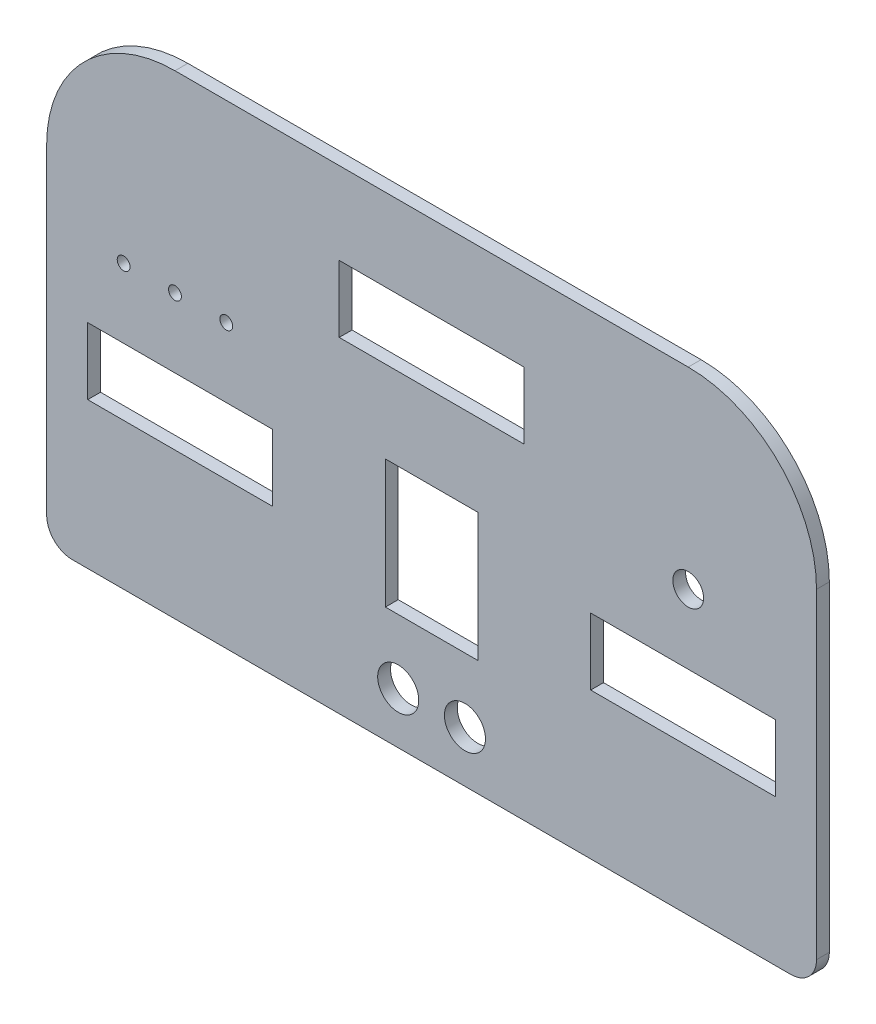
ISO-10303-21;
HEADER;
FILE_DESCRIPTION(('STEP AP214'),'2;1');
FILE_NAME('part.step','',(''),(''),'','','');
FILE_SCHEMA(('AUTOMOTIVE_DESIGN { 1 0 10303 214 1 1 1 1 }'));
ENDSEC;
DATA;
#1=APPLICATION_CONTEXT('core data for automotive mechanical design processes');
#2=APPLICATION_PROTOCOL_DEFINITION('international standard','automotive_design',2000,#1);
#3=PRODUCT_CONTEXT('',#1,'mechanical');
#4=PRODUCT('Part','Part','',(#3));
#5=PRODUCT_RELATED_PRODUCT_CATEGORY('part','',(#4));
#6=PRODUCT_DEFINITION_FORMATION('','',#4);
#7=PRODUCT_DEFINITION_CONTEXT('part definition',#1,'design');
#8=PRODUCT_DEFINITION('design','',#6,#7);
#9=PRODUCT_DEFINITION_SHAPE('','',#8);
#10=(LENGTH_UNIT() NAMED_UNIT(*) SI_UNIT(.MILLI.,.METRE.));
#11=(NAMED_UNIT(*) PLANE_ANGLE_UNIT() SI_UNIT($,.RADIAN.));
#12=(NAMED_UNIT(*) SI_UNIT($,.STERADIAN.) SOLID_ANGLE_UNIT());
#13=UNCERTAINTY_MEASURE_WITH_UNIT(LENGTH_MEASURE(1.E-05),#10,'distance_accuracy_value','');
#14=(GEOMETRIC_REPRESENTATION_CONTEXT(3) GLOBAL_UNCERTAINTY_ASSIGNED_CONTEXT((#13)) GLOBAL_UNIT_ASSIGNED_CONTEXT((#10,
#11,#12)) REPRESENTATION_CONTEXT('',''));
#15=CARTESIAN_POINT('',(0.,0.,0.));
#16=DIRECTION('',(0.,0.,1.));
#17=DIRECTION('',(1.,0.,0.));
#18=AXIS2_PLACEMENT_3D('',#15,#16,#17);
#19=CARTESIAN_POINT('',(140.,-82.5,5.));
#20=DIRECTION('',(0.,0.,-1.));
#21=DIRECTION('',(-1.,0.,0.));
#22=AXIS2_PLACEMENT_3D('',#19,#20,#21);
#23=PLANE('',#22);
#24=DIRECTION('',(0.,-1.,0.));
#25=VECTOR('',#24,1.);
#26=CARTESIAN_POINT('',(62.,-35.5,5.));
#27=LINE('',#26,#25);
#28=CARTESIAN_POINT('',(62.,-9.49999999999997,5.));
#29=VERTEX_POINT('',#28);
#30=CARTESIAN_POINT('',(62.,-35.5,5.));
#31=VERTEX_POINT('',#30);
#32=EDGE_CURVE('E239',#29,#31,#27,.T.);
#33=ORIENTED_EDGE('',*,*,#32,.F.);
#34=DIRECTION('',(-1.,0.,0.));
#35=VECTOR('',#34,1.);
#36=CARTESIAN_POINT('',(134.,-9.49999999999996,5.));
#37=LINE('',#36,#35);
#38=CARTESIAN_POINT('',(134.,-9.49999999999997,5.));
#39=VERTEX_POINT('',#38);
#40=EDGE_CURVE('E247',#39,#29,#37,.T.);
#41=ORIENTED_EDGE('',*,*,#40,.F.);
#42=DIRECTION('',(0.,1.,0.));
#43=VECTOR('',#42,1.);
#44=CARTESIAN_POINT('',(134.,-35.5,5.));
#45=LINE('',#44,#43);
#46=CARTESIAN_POINT('',(134.,-35.5,5.));
#47=VERTEX_POINT('',#46);
#48=EDGE_CURVE('E244',#47,#39,#45,.T.);
#49=ORIENTED_EDGE('',*,*,#48,.F.);
#50=DIRECTION('',(1.,0.,0.));
#51=VECTOR('',#50,1.);
#52=CARTESIAN_POINT('',(134.,-35.5,5.));
#53=LINE('',#52,#51);
#54=EDGE_CURVE('E241',#31,#47,#53,.T.);
#55=ORIENTED_EDGE('',*,*,#54,.F.);
#56=EDGE_LOOP('',(#33,#41,#49,#55));
#57=FACE_BOUND('',#56,.T.);
#58=DIRECTION('',(0.,1.,0.));
#59=VECTOR('',#58,1.);
#60=CARTESIAN_POINT('',(-62.,-9.49999999999999,5.));
#61=LINE('',#60,#59);
#62=CARTESIAN_POINT('',(-62.,-35.5,5.));
#63=VERTEX_POINT('',#62);
#64=CARTESIAN_POINT('',(-62.,-9.49999999999999,5.));
#65=VERTEX_POINT('',#64);
#66=EDGE_CURVE('E301',#63,#65,#61,.T.);
#67=ORIENTED_EDGE('',*,*,#66,.F.);
#68=DIRECTION('',(1.,0.,0.));
#69=VECTOR('',#68,1.);
#70=CARTESIAN_POINT('',(-134.,-35.5,5.));
#71=LINE('',#70,#69);
#72=CARTESIAN_POINT('',(-134.,-35.5,5.));
#73=VERTEX_POINT('',#72);
#74=EDGE_CURVE('E309',#73,#63,#71,.T.);
#75=ORIENTED_EDGE('',*,*,#74,.F.);
#76=DIRECTION('',(0.,-1.,0.));
#77=VECTOR('',#76,1.);
#78=CARTESIAN_POINT('',(-134.,-9.49999999999999,5.));
#79=LINE('',#78,#77);
#80=CARTESIAN_POINT('',(-134.,-9.49999999999999,5.));
#81=VERTEX_POINT('',#80);
#82=EDGE_CURVE('E306',#81,#73,#79,.T.);
#83=ORIENTED_EDGE('',*,*,#82,.F.);
#84=DIRECTION('',(-1.,0.,0.));
#85=VECTOR('',#84,1.);
#86=CARTESIAN_POINT('',(-134.,-9.49999999999999,5.));
#87=LINE('',#86,#85);
#88=EDGE_CURVE('E303',#65,#81,#87,.T.);
#89=ORIENTED_EDGE('',*,*,#88,.F.);
#90=EDGE_LOOP('',(#67,#75,#83,#89));
#91=FACE_BOUND('',#90,.T.);
#92=CARTESIAN_POINT('',(140.,-82.5,5.));
#93=DIRECTION('',(0.,0.,1.));
#94=DIRECTION('',(-1.,0.,0.));
#95=AXIS2_PLACEMENT_3D('',#92,#93,#94);
#96=CIRCLE('',#95,9.99999999999999);
#97=CARTESIAN_POINT('',(140.,-92.5,5.));
#98=VERTEX_POINT('',#97);
#99=CARTESIAN_POINT('',(150.,-82.5,5.));
#100=VERTEX_POINT('',#99);
#101=EDGE_CURVE('E332',#98,#100,#96,.T.);
#102=ORIENTED_EDGE('',*,*,#101,.T.);
#103=DIRECTION('',(0.,1.,0.));
#104=VECTOR('',#103,1.);
#105=CARTESIAN_POINT('',(150.,-82.5,5.));
#106=LINE('',#105,#104);
#107=CARTESIAN_POINT('',(150.,42.5,5.));
#108=VERTEX_POINT('',#107);
#109=EDGE_CURVE('E335',#100,#108,#106,.T.);
#110=ORIENTED_EDGE('',*,*,#109,.T.);
#111=CARTESIAN_POINT('',(100.,42.5,5.));
#112=DIRECTION('',(0.,0.,1.));
#113=DIRECTION('',(-1.,0.,0.));
#114=AXIS2_PLACEMENT_3D('',#111,#112,#113);
#115=CIRCLE('',#114,50.);
#116=CARTESIAN_POINT('',(100.,92.5,5.));
#117=VERTEX_POINT('',#116);
#118=EDGE_CURVE('E338',#108,#117,#115,.T.);
#119=ORIENTED_EDGE('',*,*,#118,.T.);
#120=DIRECTION('',(-1.,0.,0.));
#121=VECTOR('',#120,1.);
#122=CARTESIAN_POINT('',(100.,92.5,5.));
#123=LINE('',#122,#121);
#124=CARTESIAN_POINT('',(-100.,92.5,5.));
#125=VERTEX_POINT('',#124);
#126=EDGE_CURVE('E340',#117,#125,#123,.T.);
#127=ORIENTED_EDGE('',*,*,#126,.T.);
#128=CARTESIAN_POINT('',(-99.9999999999999,42.5,5.));
#129=DIRECTION('',(0.,0.,1.));
#130=DIRECTION('',(-1.,0.,0.));
#131=AXIS2_PLACEMENT_3D('',#128,#129,#130);
#132=CIRCLE('',#131,50.);
#133=CARTESIAN_POINT('',(-150.,42.5,5.));
#134=VERTEX_POINT('',#133);
#135=EDGE_CURVE('E342',#125,#134,#132,.T.);
#136=ORIENTED_EDGE('',*,*,#135,.T.);
#137=DIRECTION('',(0.,-1.,0.));
#138=VECTOR('',#137,1.);
#139=CARTESIAN_POINT('',(-150.,-82.5,5.));
#140=LINE('',#139,#138);
#141=CARTESIAN_POINT('',(-150.,-82.5,5.));
#142=VERTEX_POINT('',#141);
#143=EDGE_CURVE('E344',#134,#142,#140,.T.);
#144=ORIENTED_EDGE('',*,*,#143,.T.);
#145=CARTESIAN_POINT('',(-140.,-82.5,5.));
#146=DIRECTION('',(0.,0.,1.));
#147=DIRECTION('',(-1.,0.,0.));
#148=AXIS2_PLACEMENT_3D('',#145,#146,#147);
#149=CIRCLE('',#148,10.);
#150=CARTESIAN_POINT('',(-140.,-92.5000000000001,5.));
#151=VERTEX_POINT('',#150);
#152=EDGE_CURVE('E346',#142,#151,#149,.T.);
#153=ORIENTED_EDGE('',*,*,#152,.T.);
#154=DIRECTION('',(1.,0.,0.));
#155=VECTOR('',#154,1.);
#156=CARTESIAN_POINT('',(140.,-92.5,5.));
#157=LINE('',#156,#155);
#158=EDGE_CURVE('E348',#151,#98,#157,.T.);
#159=ORIENTED_EDGE('',*,*,#158,.T.);
#160=EDGE_LOOP('',(#102,#110,#119,#127,#136,#144,#153,#159));
#161=FACE_BOUND('',#160,.T.);
#162=DIRECTION('',(0.,-1.,0.));
#163=VECTOR('',#162,1.);
#164=CARTESIAN_POINT('',(-36.,34.5,5.));
#165=LINE('',#164,#163);
#166=CARTESIAN_POINT('',(-36.,60.5,5.));
#167=VERTEX_POINT('',#166);
#168=CARTESIAN_POINT('',(-36.,34.5,5.));
#169=VERTEX_POINT('',#168);
#170=EDGE_CURVE('E270',#167,#169,#165,.T.);
#171=ORIENTED_EDGE('',*,*,#170,.F.);
#172=DIRECTION('',(-1.,0.,0.));
#173=VECTOR('',#172,1.);
#174=CARTESIAN_POINT('',(36.,60.5,5.));
#175=LINE('',#174,#173);
#176=CARTESIAN_POINT('',(36.,60.5,5.));
#177=VERTEX_POINT('',#176);
#178=EDGE_CURVE('E278',#177,#167,#175,.T.);
#179=ORIENTED_EDGE('',*,*,#178,.F.);
#180=DIRECTION('',(0.,1.,0.));
#181=VECTOR('',#180,1.);
#182=CARTESIAN_POINT('',(36.,34.5,5.));
#183=LINE('',#182,#181);
#184=CARTESIAN_POINT('',(36.,34.5,5.));
#185=VERTEX_POINT('',#184);
#186=EDGE_CURVE('E275',#185,#177,#183,.T.);
#187=ORIENTED_EDGE('',*,*,#186,.F.);
#188=DIRECTION('',(1.,0.,0.));
#189=VECTOR('',#188,1.);
#190=CARTESIAN_POINT('',(36.,34.5,5.));
#191=LINE('',#190,#189);
#192=EDGE_CURVE('E272',#169,#185,#191,.T.);
#193=ORIENTED_EDGE('',*,*,#192,.F.);
#194=EDGE_LOOP('',(#171,#179,#187,#193));
#195=FACE_BOUND('',#194,.T.);
#196=DIRECTION('',(0.,-1.,0.));
#197=VECTOR('',#196,1.);
#198=CARTESIAN_POINT('',(-18.,-47.5,5.));
#199=LINE('',#198,#197);
#200=CARTESIAN_POINT('',(-18.,2.5,5.));
#201=VERTEX_POINT('',#200);
#202=CARTESIAN_POINT('',(-18.,-47.5,5.));
#203=VERTEX_POINT('',#202);
#204=EDGE_CURVE('E200',#201,#203,#199,.T.);
#205=ORIENTED_EDGE('',*,*,#204,.F.);
#206=DIRECTION('',(-1.,0.,0.));
#207=VECTOR('',#206,1.);
#208=CARTESIAN_POINT('',(18.,2.50000000000001,5.));
#209=LINE('',#208,#207);
#210=CARTESIAN_POINT('',(18.,2.50000000000001,5.));
#211=VERTEX_POINT('',#210);
#212=EDGE_CURVE('E223',#211,#201,#209,.T.);
#213=ORIENTED_EDGE('',*,*,#212,.F.);
#214=DIRECTION('',(0.,1.,0.));
#215=VECTOR('',#214,1.);
#216=CARTESIAN_POINT('',(18.,-47.5,5.));
#217=LINE('',#216,#215);
#218=CARTESIAN_POINT('',(18.,-47.5,5.));
#219=VERTEX_POINT('',#218);
#220=EDGE_CURVE('E221',#219,#211,#217,.T.);
#221=ORIENTED_EDGE('',*,*,#220,.F.);
#222=DIRECTION('',(1.,0.,0.));
#223=VECTOR('',#222,1.);
#224=CARTESIAN_POINT('',(18.,-47.5,5.));
#225=LINE('',#224,#223);
#226=EDGE_CURVE('E208',#203,#219,#225,.T.);
#227=ORIENTED_EDGE('',*,*,#226,.F.);
#228=EDGE_LOOP('',(#205,#213,#221,#227));
#229=FACE_BOUND('',#228,.T.);
#230=CARTESIAN_POINT('',(-13.,-72.5,5.));
#231=DIRECTION('',(0.,0.,1.));
#232=DIRECTION('',(1.,0.,0.));
#233=AXIS2_PLACEMENT_3D('',#230,#231,#232);
#234=CIRCLE('',#233,8.00000000000001);
#235=CARTESIAN_POINT('',(-4.99999999999996,-72.5,5.));
#236=VERTEX_POINT('',#235);
#237=EDGE_CURVE('E229',#236,#236,#234,.T.);
#238=ORIENTED_EDGE('',*,*,#237,.F.);
#239=EDGE_LOOP('',(#238));
#240=FACE_BOUND('',#239,.T.);
#241=CARTESIAN_POINT('',(100.,17.5,5.));
#242=DIRECTION('',(0.,0.,1.));
#243=DIRECTION('',(1.,0.,0.));
#244=AXIS2_PLACEMENT_3D('',#241,#242,#243);
#245=CIRCLE('',#244,6.00000000000002);
#246=CARTESIAN_POINT('',(106.,17.5,5.));
#247=VERTEX_POINT('',#246);
#248=EDGE_CURVE('E576',#247,#247,#245,.T.);
#249=ORIENTED_EDGE('',*,*,#248,.F.);
#250=EDGE_LOOP('',(#249));
#251=FACE_BOUND('',#250,.T.);
#252=CARTESIAN_POINT('',(13.,-72.5,5.));
#253=DIRECTION('',(0.,0.,1.));
#254=DIRECTION('',(-1.,0.,0.));
#255=AXIS2_PLACEMENT_3D('',#252,#253,#254);
#256=CIRCLE('',#255,8.00000000000001);
#257=CARTESIAN_POINT('',(4.99999999999996,-72.5,5.));
#258=VERTEX_POINT('',#257);
#259=EDGE_CURVE('E570',#258,#258,#256,.T.);
#260=ORIENTED_EDGE('',*,*,#259,.F.);
#261=EDGE_LOOP('',(#260));
#262=FACE_BOUND('',#261,.T.);
#263=CARTESIAN_POINT('',(-100.,17.5,5.));
#264=DIRECTION('',(0.,0.,1.));
#265=DIRECTION('',(1.,0.,0.));
#266=AXIS2_PLACEMENT_3D('',#263,#264,#265);
#267=CIRCLE('',#266,2.50000000000001);
#268=CARTESIAN_POINT('',(-97.5,17.5,5.));
#269=VERTEX_POINT('',#268);
#270=EDGE_CURVE('E564',#269,#269,#267,.T.);
#271=ORIENTED_EDGE('',*,*,#270,.F.);
#272=EDGE_LOOP('',(#271));
#273=FACE_BOUND('',#272,.T.);
#274=CARTESIAN_POINT('',(-120.,17.5,5.));
#275=DIRECTION('',(0.,0.,1.));
#276=DIRECTION('',(1.,0.,0.));
#277=AXIS2_PLACEMENT_3D('',#274,#275,#276);
#278=CIRCLE('',#277,2.5);
#279=CARTESIAN_POINT('',(-117.5,17.5,5.));
#280=VERTEX_POINT('',#279);
#281=EDGE_CURVE('E558',#280,#280,#278,.T.);
#282=ORIENTED_EDGE('',*,*,#281,.F.);
#283=EDGE_LOOP('',(#282));
#284=FACE_BOUND('',#283,.T.);
#285=CARTESIAN_POINT('',(-80.,17.5,5.));
#286=DIRECTION('',(0.,0.,1.));
#287=DIRECTION('',(1.,0.,0.));
#288=AXIS2_PLACEMENT_3D('',#285,#286,#287);
#289=CIRCLE('',#288,2.5);
#290=CARTESIAN_POINT('',(-77.5,17.5,5.));
#291=VERTEX_POINT('',#290);
#292=EDGE_CURVE('E549',#291,#291,#289,.T.);
#293=ORIENTED_EDGE('',*,*,#292,.F.);
#294=EDGE_LOOP('',(#293));
#295=FACE_BOUND('',#294,.T.);
#296=ADVANCED_FACE('F39',(#57,#91,#161,#195,#229,#240,#251,#262,#273,#284,#295),#23,.F.);
#297=CARTESIAN_POINT('',(140.,-82.5,0.));
#298=DIRECTION('',(0.,0.,-1.));
#299=DIRECTION('',(-1.,0.,0.));
#300=AXIS2_PLACEMENT_3D('',#297,#298,#299);
#301=PLANE('',#300);
#302=CARTESIAN_POINT('',(-120.,17.5,0.));
#303=DIRECTION('',(0.,0.,1.));
#304=DIRECTION('',(1.,0.,0.));
#305=AXIS2_PLACEMENT_3D('',#302,#303,#304);
#306=CIRCLE('',#305,2.5);
#307=CARTESIAN_POINT('',(-117.5,17.5,0.));
#308=VERTEX_POINT('',#307);
#309=EDGE_CURVE('E555',#308,#308,#306,.T.);
#310=ORIENTED_EDGE('',*,*,#309,.T.);
#311=EDGE_LOOP('',(#310));
#312=FACE_BOUND('',#311,.T.);
#313=CARTESIAN_POINT('',(13.,-72.5,0.));
#314=DIRECTION('',(0.,0.,1.));
#315=DIRECTION('',(-1.,0.,0.));
#316=AXIS2_PLACEMENT_3D('',#313,#314,#315);
#317=CIRCLE('',#316,8.00000000000001);
#318=CARTESIAN_POINT('',(4.99999999999996,-72.5,0.));
#319=VERTEX_POINT('',#318);
#320=EDGE_CURVE('E567',#319,#319,#317,.T.);
#321=ORIENTED_EDGE('',*,*,#320,.T.);
#322=EDGE_LOOP('',(#321));
#323=FACE_BOUND('',#322,.T.);
#324=CARTESIAN_POINT('',(-13.,-72.5,0.));
#325=DIRECTION('',(0.,0.,1.));
#326=DIRECTION('',(1.,0.,0.));
#327=AXIS2_PLACEMENT_3D('',#324,#325,#326);
#328=CIRCLE('',#327,8.00000000000001);
#329=CARTESIAN_POINT('',(-4.99999999999996,-72.5,0.));
#330=VERTEX_POINT('',#329);
#331=EDGE_CURVE('E579',#330,#330,#328,.T.);
#332=ORIENTED_EDGE('',*,*,#331,.T.);
#333=EDGE_LOOP('',(#332));
#334=FACE_BOUND('',#333,.T.);
#335=CARTESIAN_POINT('',(140.,-82.5,0.));
#336=DIRECTION('',(0.,0.,1.));
#337=DIRECTION('',(-1.,0.,0.));
#338=AXIS2_PLACEMENT_3D('',#335,#336,#337);
#339=CIRCLE('',#338,9.99999999999999);
#340=CARTESIAN_POINT('',(140.,-92.5,0.));
#341=VERTEX_POINT('',#340);
#342=CARTESIAN_POINT('',(150.,-82.5,0.));
#343=VERTEX_POINT('',#342);
#344=EDGE_CURVE('E331',#341,#343,#339,.T.);
#345=ORIENTED_EDGE('',*,*,#344,.F.);
#346=DIRECTION('',(1.,0.,0.));
#347=VECTOR('',#346,1.);
#348=CARTESIAN_POINT('',(140.,-92.5,0.));
#349=LINE('',#348,#347);
#350=CARTESIAN_POINT('',(-140.,-92.5000000000001,0.));
#351=VERTEX_POINT('',#350);
#352=EDGE_CURVE('E336',#351,#341,#349,.T.);
#353=ORIENTED_EDGE('',*,*,#352,.F.);
#354=CARTESIAN_POINT('',(-140.,-82.5,0.));
#355=DIRECTION('',(0.,0.,1.));
#356=DIRECTION('',(-1.,0.,0.));
#357=AXIS2_PLACEMENT_3D('',#354,#355,#356);
#358=CIRCLE('',#357,10.);
#359=CARTESIAN_POINT('',(-150.,-82.5,0.));
#360=VERTEX_POINT('',#359);
#361=EDGE_CURVE('E363',#360,#351,#358,.T.);
#362=ORIENTED_EDGE('',*,*,#361,.F.);
#363=DIRECTION('',(0.,-1.,0.));
#364=VECTOR('',#363,1.);
#365=CARTESIAN_POINT('',(-150.,-82.5,0.));
#366=LINE('',#365,#364);
#367=CARTESIAN_POINT('',(-150.,42.5,0.));
#368=VERTEX_POINT('',#367);
#369=EDGE_CURVE('E361',#368,#360,#366,.T.);
#370=ORIENTED_EDGE('',*,*,#369,.F.);
#371=CARTESIAN_POINT('',(-99.9999999999999,42.5,0.));
#372=DIRECTION('',(0.,0.,1.));
#373=DIRECTION('',(-1.,0.,0.));
#374=AXIS2_PLACEMENT_3D('',#371,#372,#373);
#375=CIRCLE('',#374,50.);
#376=CARTESIAN_POINT('',(-100.,92.5,0.));
#377=VERTEX_POINT('',#376);
#378=EDGE_CURVE('E359',#377,#368,#375,.T.);
#379=ORIENTED_EDGE('',*,*,#378,.F.);
#380=DIRECTION('',(-1.,0.,0.));
#381=VECTOR('',#380,1.);
#382=CARTESIAN_POINT('',(100.,92.5,0.));
#383=LINE('',#382,#381);
#384=CARTESIAN_POINT('',(100.,92.5,0.));
#385=VERTEX_POINT('',#384);
#386=EDGE_CURVE('E357',#385,#377,#383,.T.);
#387=ORIENTED_EDGE('',*,*,#386,.F.);
#388=CARTESIAN_POINT('',(100.,42.5,0.));
#389=DIRECTION('',(0.,0.,1.));
#390=DIRECTION('',(-1.,0.,0.));
#391=AXIS2_PLACEMENT_3D('',#388,#389,#390);
#392=CIRCLE('',#391,50.);
#393=CARTESIAN_POINT('',(150.,42.5,0.));
#394=VERTEX_POINT('',#393);
#395=EDGE_CURVE('E355',#394,#385,#392,.T.);
#396=ORIENTED_EDGE('',*,*,#395,.F.);
#397=DIRECTION('',(0.,1.,0.));
#398=VECTOR('',#397,1.);
#399=CARTESIAN_POINT('',(150.,-82.5,0.));
#400=LINE('',#399,#398);
#401=EDGE_CURVE('E353',#343,#394,#400,.T.);
#402=ORIENTED_EDGE('',*,*,#401,.F.);
#403=EDGE_LOOP('',(#345,#353,#362,#370,#379,#387,#396,#402));
#404=FACE_BOUND('',#403,.T.);
#405=DIRECTION('',(1.,0.,0.));
#406=VECTOR('',#405,1.);
#407=CARTESIAN_POINT('',(-134.,-35.5,0.));
#408=LINE('',#407,#406);
#409=CARTESIAN_POINT('',(-134.,-35.5,0.));
#410=VERTEX_POINT('',#409);
#411=CARTESIAN_POINT('',(-62.,-35.5,0.));
#412=VERTEX_POINT('',#411);
#413=EDGE_CURVE('E304',#410,#412,#408,.T.);
#414=ORIENTED_EDGE('',*,*,#413,.T.);
#415=DIRECTION('',(0.,1.,0.));
#416=VECTOR('',#415,1.);
#417=CARTESIAN_POINT('',(-62.,-9.49999999999999,0.));
#418=LINE('',#417,#416);
#419=CARTESIAN_POINT('',(-62.,-9.49999999999999,0.));
#420=VERTEX_POINT('',#419);
#421=EDGE_CURVE('E300',#412,#420,#418,.T.);
#422=ORIENTED_EDGE('',*,*,#421,.T.);
#423=DIRECTION('',(-1.,0.,0.));
#424=VECTOR('',#423,1.);
#425=CARTESIAN_POINT('',(-134.,-9.49999999999999,0.));
#426=LINE('',#425,#424);
#427=CARTESIAN_POINT('',(-134.,-9.49999999999999,0.));
#428=VERTEX_POINT('',#427);
#429=EDGE_CURVE('E314',#420,#428,#426,.T.);
#430=ORIENTED_EDGE('',*,*,#429,.T.);
#431=DIRECTION('',(0.,-1.,0.));
#432=VECTOR('',#431,1.);
#433=CARTESIAN_POINT('',(-134.,-9.49999999999999,0.));
#434=LINE('',#433,#432);
#435=EDGE_CURVE('E317',#428,#410,#434,.T.);
#436=ORIENTED_EDGE('',*,*,#435,.T.);
#437=EDGE_LOOP('',(#414,#422,#430,#436));
#438=FACE_BOUND('',#437,.T.);
#439=DIRECTION('',(-1.,0.,0.));
#440=VECTOR('',#439,1.);
#441=CARTESIAN_POINT('',(36.,60.5,0.));
#442=LINE('',#441,#440);
#443=CARTESIAN_POINT('',(36.,60.5,0.));
#444=VERTEX_POINT('',#443);
#445=CARTESIAN_POINT('',(-36.,60.5,0.));
#446=VERTEX_POINT('',#445);
#447=EDGE_CURVE('E273',#444,#446,#442,.T.);
#448=ORIENTED_EDGE('',*,*,#447,.T.);
#449=DIRECTION('',(0.,-1.,0.));
#450=VECTOR('',#449,1.);
#451=CARTESIAN_POINT('',(-36.,34.5,0.));
#452=LINE('',#451,#450);
#453=CARTESIAN_POINT('',(-36.,34.5,0.));
#454=VERTEX_POINT('',#453);
#455=EDGE_CURVE('E269',#446,#454,#452,.T.);
#456=ORIENTED_EDGE('',*,*,#455,.T.);
#457=DIRECTION('',(1.,0.,0.));
#458=VECTOR('',#457,1.);
#459=CARTESIAN_POINT('',(36.,34.5,0.));
#460=LINE('',#459,#458);
#461=CARTESIAN_POINT('',(36.,34.5,0.));
#462=VERTEX_POINT('',#461);
#463=EDGE_CURVE('E283',#454,#462,#460,.T.);
#464=ORIENTED_EDGE('',*,*,#463,.T.);
#465=DIRECTION('',(0.,1.,0.));
#466=VECTOR('',#465,1.);
#467=CARTESIAN_POINT('',(36.,34.5,0.));
#468=LINE('',#467,#466);
#469=EDGE_CURVE('E286',#462,#444,#468,.T.);
#470=ORIENTED_EDGE('',*,*,#469,.T.);
#471=EDGE_LOOP('',(#448,#456,#464,#470));
#472=FACE_BOUND('',#471,.T.);
#473=DIRECTION('',(-1.,0.,0.));
#474=VECTOR('',#473,1.);
#475=CARTESIAN_POINT('',(134.,-9.49999999999996,0.));
#476=LINE('',#475,#474);
#477=CARTESIAN_POINT('',(134.,-9.49999999999996,0.));
#478=VERTEX_POINT('',#477);
#479=CARTESIAN_POINT('',(62.,-9.49999999999997,0.));
#480=VERTEX_POINT('',#479);
#481=EDGE_CURVE('E242',#478,#480,#476,.T.);
#482=ORIENTED_EDGE('',*,*,#481,.T.);
#483=DIRECTION('',(0.,-1.,0.));
#484=VECTOR('',#483,1.);
#485=CARTESIAN_POINT('',(62.,-35.5,0.));
#486=LINE('',#485,#484);
#487=CARTESIAN_POINT('',(62.,-35.5,0.));
#488=VERTEX_POINT('',#487);
#489=EDGE_CURVE('E216',#480,#488,#486,.T.);
#490=ORIENTED_EDGE('',*,*,#489,.T.);
#491=DIRECTION('',(1.,0.,0.));
#492=VECTOR('',#491,1.);
#493=CARTESIAN_POINT('',(134.,-35.5,0.));
#494=LINE('',#493,#492);
#495=CARTESIAN_POINT('',(134.,-35.5,0.));
#496=VERTEX_POINT('',#495);
#497=EDGE_CURVE('E252',#488,#496,#494,.T.);
#498=ORIENTED_EDGE('',*,*,#497,.T.);
#499=DIRECTION('',(0.,1.,0.));
#500=VECTOR('',#499,1.);
#501=CARTESIAN_POINT('',(134.,-35.5,0.));
#502=LINE('',#501,#500);
#503=EDGE_CURVE('E255',#496,#478,#502,.T.);
#504=ORIENTED_EDGE('',*,*,#503,.T.);
#505=EDGE_LOOP('',(#482,#490,#498,#504));
#506=FACE_BOUND('',#505,.T.);
#507=DIRECTION('',(-1.,0.,0.));
#508=VECTOR('',#507,1.);
#509=CARTESIAN_POINT('',(18.,2.50000000000001,0.));
#510=LINE('',#509,#508);
#511=CARTESIAN_POINT('',(18.,2.50000000000001,0.));
#512=VERTEX_POINT('',#511);
#513=CARTESIAN_POINT('',(-18.,2.5,0.));
#514=VERTEX_POINT('',#513);
#515=EDGE_CURVE('E209',#512,#514,#510,.T.);
#516=ORIENTED_EDGE('',*,*,#515,.T.);
#517=DIRECTION('',(0.,-1.,0.));
#518=VECTOR('',#517,1.);
#519=CARTESIAN_POINT('',(-18.,-47.5,0.));
#520=LINE('',#519,#518);
#521=CARTESIAN_POINT('',(-18.,-47.5,0.));
#522=VERTEX_POINT('',#521);
#523=EDGE_CURVE('E62',#514,#522,#520,.T.);
#524=ORIENTED_EDGE('',*,*,#523,.T.);
#525=DIRECTION('',(1.,0.,0.));
#526=VECTOR('',#525,1.);
#527=CARTESIAN_POINT('',(18.,-47.5,0.));
#528=LINE('',#527,#526);
#529=CARTESIAN_POINT('',(18.,-47.5,0.));
#530=VERTEX_POINT('',#529);
#531=EDGE_CURVE('E215',#522,#530,#528,.T.);
#532=ORIENTED_EDGE('',*,*,#531,.T.);
#533=DIRECTION('',(0.,1.,0.));
#534=VECTOR('',#533,1.);
#535=CARTESIAN_POINT('',(18.,-47.5,0.));
#536=LINE('',#535,#534);
#537=EDGE_CURVE('E231',#530,#512,#536,.T.);
#538=ORIENTED_EDGE('',*,*,#537,.T.);
#539=EDGE_LOOP('',(#516,#524,#532,#538));
#540=FACE_BOUND('',#539,.T.);
#541=CARTESIAN_POINT('',(100.,17.5,0.));
#542=DIRECTION('',(0.,0.,1.));
#543=DIRECTION('',(1.,0.,0.));
#544=AXIS2_PLACEMENT_3D('',#541,#542,#543);
#545=CIRCLE('',#544,6.00000000000002);
#546=CARTESIAN_POINT('',(106.,17.5,0.));
#547=VERTEX_POINT('',#546);
#548=EDGE_CURVE('E573',#547,#547,#545,.T.);
#549=ORIENTED_EDGE('',*,*,#548,.T.);
#550=EDGE_LOOP('',(#549));
#551=FACE_BOUND('',#550,.T.);
#552=CARTESIAN_POINT('',(-100.,17.5,0.));
#553=DIRECTION('',(0.,0.,1.));
#554=DIRECTION('',(1.,0.,0.));
#555=AXIS2_PLACEMENT_3D('',#552,#553,#554);
#556=CIRCLE('',#555,2.50000000000001);
#557=CARTESIAN_POINT('',(-97.5,17.5,0.));
#558=VERTEX_POINT('',#557);
#559=EDGE_CURVE('E561',#558,#558,#556,.T.);
#560=ORIENTED_EDGE('',*,*,#559,.T.);
#561=EDGE_LOOP('',(#560));
#562=FACE_BOUND('',#561,.T.);
#563=CARTESIAN_POINT('',(-80.,17.5,0.));
#564=DIRECTION('',(0.,0.,1.));
#565=DIRECTION('',(1.,0.,0.));
#566=AXIS2_PLACEMENT_3D('',#563,#564,#565);
#567=CIRCLE('',#566,2.5);
#568=CARTESIAN_POINT('',(-77.5,17.5,0.));
#569=VERTEX_POINT('',#568);
#570=EDGE_CURVE('E552',#569,#569,#567,.T.);
#571=ORIENTED_EDGE('',*,*,#570,.T.);
#572=EDGE_LOOP('',(#571));
#573=FACE_BOUND('',#572,.T.);
#574=ADVANCED_FACE('F393',(#312,#323,#334,#404,#438,#472,#506,#540,#551,#562,#573),#301,.T.);
#575=CARTESIAN_POINT('',(140.,-82.5,5.));
#576=DIRECTION('',(0.,0.,-1.));
#577=DIRECTION('',(-1.,0.,0.));
#578=AXIS2_PLACEMENT_3D('',#575,#576,#577);
#579=CYLINDRICAL_SURFACE('',#578,9.99999999999999);
#580=ORIENTED_EDGE('',*,*,#344,.T.);
#581=DIRECTION('',(0.,0.,-1.));
#582=VECTOR('',#581,1.);
#583=CARTESIAN_POINT('',(150.,-82.5,5.));
#584=LINE('',#583,#582);
#585=EDGE_CURVE('E11',#100,#343,#584,.T.);
#586=ORIENTED_EDGE('',*,*,#585,.F.);
#587=ORIENTED_EDGE('',*,*,#101,.F.);
#588=DIRECTION('',(0.,0.,-1.));
#589=VECTOR('',#588,1.);
#590=CARTESIAN_POINT('',(140.,-92.5,5.));
#591=LINE('',#590,#589);
#592=EDGE_CURVE('E350',#98,#341,#591,.T.);
#593=ORIENTED_EDGE('',*,*,#592,.T.);
#594=EDGE_LOOP('',(#580,#586,#587,#593));
#595=FACE_BOUND('',#594,.T.);
#596=ADVANCED_FACE('F41',(#595),#579,.T.);
#597=CARTESIAN_POINT('',(150.,-82.5,5.));
#598=DIRECTION('',(-1.,0.,0.));
#599=DIRECTION('',(0.,-1.,0.));
#600=AXIS2_PLACEMENT_3D('',#597,#598,#599);
#601=PLANE('',#600);
#602=ORIENTED_EDGE('',*,*,#401,.T.);
#603=DIRECTION('',(0.,0.,-1.));
#604=VECTOR('',#603,1.);
#605=CARTESIAN_POINT('',(150.,42.5,5.));
#606=LINE('',#605,#604);
#607=EDGE_CURVE('E47',#108,#394,#606,.T.);
#608=ORIENTED_EDGE('',*,*,#607,.F.);
#609=ORIENTED_EDGE('',*,*,#109,.F.);
#610=ORIENTED_EDGE('',*,*,#585,.T.);
#611=EDGE_LOOP('',(#602,#608,#609,#610));
#612=FACE_BOUND('',#611,.T.);
#613=ADVANCED_FACE('F411',(#612),#601,.F.);
#614=CARTESIAN_POINT('',(100.,42.5,5.));
#615=DIRECTION('',(0.,0.,-1.));
#616=DIRECTION('',(-1.,0.,0.));
#617=AXIS2_PLACEMENT_3D('',#614,#615,#616);
#618=CYLINDRICAL_SURFACE('',#617,50.);
#619=ORIENTED_EDGE('',*,*,#395,.T.);
#620=DIRECTION('',(0.,0.,-1.));
#621=VECTOR('',#620,1.);
#622=CARTESIAN_POINT('',(100.,92.5,5.));
#623=LINE('',#622,#621);
#624=EDGE_CURVE('E380',#117,#385,#623,.T.);
#625=ORIENTED_EDGE('',*,*,#624,.F.);
#626=ORIENTED_EDGE('',*,*,#118,.F.);
#627=ORIENTED_EDGE('',*,*,#607,.T.);
#628=EDGE_LOOP('',(#619,#625,#626,#627));
#629=FACE_BOUND('',#628,.T.);
#630=ADVANCED_FACE('F387',(#629),#618,.T.);
#631=CARTESIAN_POINT('',(100.,92.5,5.));
#632=DIRECTION('',(0.,-1.,0.));
#633=DIRECTION('',(1.,0.,0.));
#634=AXIS2_PLACEMENT_3D('',#631,#632,#633);
#635=PLANE('',#634);
#636=ORIENTED_EDGE('',*,*,#386,.T.);
#637=DIRECTION('',(0.,0.,-1.));
#638=VECTOR('',#637,1.);
#639=CARTESIAN_POINT('',(-100.,92.5,5.));
#640=LINE('',#639,#638);
#641=EDGE_CURVE('E377',#125,#377,#640,.T.);
#642=ORIENTED_EDGE('',*,*,#641,.F.);
#643=ORIENTED_EDGE('',*,*,#126,.F.);
#644=ORIENTED_EDGE('',*,*,#624,.T.);
#645=EDGE_LOOP('',(#636,#642,#643,#644));
#646=FACE_BOUND('',#645,.T.);
#647=ADVANCED_FACE('F399',(#646),#635,.F.);
#648=CARTESIAN_POINT('',(-99.9999999999999,42.5,5.));
#649=DIRECTION('',(0.,0.,-1.));
#650=DIRECTION('',(-1.,0.,0.));
#651=AXIS2_PLACEMENT_3D('',#648,#649,#650);
#652=CYLINDRICAL_SURFACE('',#651,50.);
#653=ORIENTED_EDGE('',*,*,#378,.T.);
#654=DIRECTION('',(0.,0.,-1.));
#655=VECTOR('',#654,1.);
#656=CARTESIAN_POINT('',(-150.,42.5,5.));
#657=LINE('',#656,#655);
#658=EDGE_CURVE('E374',#134,#368,#657,.T.);
#659=ORIENTED_EDGE('',*,*,#658,.F.);
#660=ORIENTED_EDGE('',*,*,#135,.F.);
#661=ORIENTED_EDGE('',*,*,#641,.T.);
#662=EDGE_LOOP('',(#653,#659,#660,#661));
#663=FACE_BOUND('',#662,.T.);
#664=ADVANCED_FACE('F403',(#663),#652,.T.);
#665=CARTESIAN_POINT('',(-150.,-82.5,5.));
#666=DIRECTION('',(1.,0.,0.));
#667=DIRECTION('',(0.,1.,0.));
#668=AXIS2_PLACEMENT_3D('',#665,#666,#667);
#669=PLANE('',#668);
#670=ORIENTED_EDGE('',*,*,#369,.T.);
#671=DIRECTION('',(0.,0.,-1.));
#672=VECTOR('',#671,1.);
#673=CARTESIAN_POINT('',(-150.,-82.5,5.));
#674=LINE('',#673,#672);
#675=EDGE_CURVE('E371',#142,#360,#674,.T.);
#676=ORIENTED_EDGE('',*,*,#675,.F.);
#677=ORIENTED_EDGE('',*,*,#143,.F.);
#678=ORIENTED_EDGE('',*,*,#658,.T.);
#679=EDGE_LOOP('',(#670,#676,#677,#678));
#680=FACE_BOUND('',#679,.T.);
#681=ADVANCED_FACE('F424',(#680),#669,.F.);
#682=CARTESIAN_POINT('',(-140.,-82.5,5.));
#683=DIRECTION('',(0.,0.,-1.));
#684=DIRECTION('',(-1.,0.,0.));
#685=AXIS2_PLACEMENT_3D('',#682,#683,#684);
#686=CYLINDRICAL_SURFACE('',#685,10.);
#687=ORIENTED_EDGE('',*,*,#361,.T.);
#688=DIRECTION('',(0.,0.,-1.));
#689=VECTOR('',#688,1.);
#690=CARTESIAN_POINT('',(-140.,-92.5000000000001,5.));
#691=LINE('',#690,#689);
#692=EDGE_CURVE('E368',#151,#351,#691,.T.);
#693=ORIENTED_EDGE('',*,*,#692,.F.);
#694=ORIENTED_EDGE('',*,*,#152,.F.);
#695=ORIENTED_EDGE('',*,*,#675,.T.);
#696=EDGE_LOOP('',(#687,#693,#694,#695));
#697=FACE_BOUND('',#696,.T.);
#698=ADVANCED_FACE('F422',(#697),#686,.T.);
#699=CARTESIAN_POINT('',(140.,-92.5,5.));
#700=DIRECTION('',(0.,1.,0.));
#701=DIRECTION('',(-1.,0.,0.));
#702=AXIS2_PLACEMENT_3D('',#699,#700,#701);
#703=PLANE('',#702);
#704=ORIENTED_EDGE('',*,*,#352,.T.);
#705=ORIENTED_EDGE('',*,*,#592,.F.);
#706=ORIENTED_EDGE('',*,*,#158,.F.);
#707=ORIENTED_EDGE('',*,*,#692,.T.);
#708=EDGE_LOOP('',(#704,#705,#706,#707));
#709=FACE_BOUND('',#708,.T.);
#710=ADVANCED_FACE('F417',(#709),#703,.F.);
#711=CARTESIAN_POINT('',(-62.,-9.49999999999999,5.));
#712=DIRECTION('',(-1.,0.,0.));
#713=DIRECTION('',(0.,-1.,0.));
#714=AXIS2_PLACEMENT_3D('',#711,#712,#713);
#715=PLANE('',#714);
#716=ORIENTED_EDGE('',*,*,#421,.F.);
#717=DIRECTION('',(0.,0.,-1.));
#718=VECTOR('',#717,1.);
#719=CARTESIAN_POINT('',(-62.,-35.5,5.));
#720=LINE('',#719,#718);
#721=EDGE_CURVE('E311',#63,#412,#720,.T.);
#722=ORIENTED_EDGE('',*,*,#721,.F.);
#723=ORIENTED_EDGE('',*,*,#66,.T.);
#724=DIRECTION('',(0.,0.,-1.));
#725=VECTOR('',#724,1.);
#726=CARTESIAN_POINT('',(-62.,-9.49999999999999,5.));
#727=LINE('',#726,#725);
#728=EDGE_CURVE('E328',#65,#420,#727,.T.);
#729=ORIENTED_EDGE('',*,*,#728,.T.);
#730=EDGE_LOOP('',(#716,#722,#723,#729));
#731=FACE_BOUND('',#730,.T.);
#732=ADVANCED_FACE('F444',(#731),#715,.T.);
#733=CARTESIAN_POINT('',(-134.,-9.49999999999999,5.));
#734=DIRECTION('',(0.,-1.,0.));
#735=DIRECTION('',(1.,0.,0.));
#736=AXIS2_PLACEMENT_3D('',#733,#734,#735);
#737=PLANE('',#736);
#738=ORIENTED_EDGE('',*,*,#429,.F.);
#739=ORIENTED_EDGE('',*,*,#728,.F.);
#740=ORIENTED_EDGE('',*,*,#88,.T.);
#741=DIRECTION('',(0.,0.,-1.));
#742=VECTOR('',#741,1.);
#743=CARTESIAN_POINT('',(-134.,-9.49999999999999,5.));
#744=LINE('',#743,#742);
#745=EDGE_CURVE('E326',#81,#428,#744,.T.);
#746=ORIENTED_EDGE('',*,*,#745,.T.);
#747=EDGE_LOOP('',(#738,#739,#740,#746));
#748=FACE_BOUND('',#747,.T.);
#749=ADVANCED_FACE('F451',(#748),#737,.T.);
#750=CARTESIAN_POINT('',(-134.,-9.49999999999999,5.));
#751=DIRECTION('',(1.,0.,0.));
#752=DIRECTION('',(0.,0.,-1.));
#753=AXIS2_PLACEMENT_3D('',#750,#751,#752);
#754=PLANE('',#753);
#755=ORIENTED_EDGE('',*,*,#435,.F.);
#756=ORIENTED_EDGE('',*,*,#745,.F.);
#757=ORIENTED_EDGE('',*,*,#82,.T.);
#758=DIRECTION('',(0.,0.,-1.));
#759=VECTOR('',#758,1.);
#760=CARTESIAN_POINT('',(-134.,-35.5,5.));
#761=LINE('',#760,#759);
#762=EDGE_CURVE('E324',#73,#410,#761,.T.);
#763=ORIENTED_EDGE('',*,*,#762,.T.);
#764=EDGE_LOOP('',(#755,#756,#757,#763));
#765=FACE_BOUND('',#764,.T.);
#766=ADVANCED_FACE('F456',(#765),#754,.T.);
#767=CARTESIAN_POINT('',(-134.,-35.5,5.));
#768=DIRECTION('',(0.,1.,0.));
#769=DIRECTION('',(0.,0.,1.));
#770=AXIS2_PLACEMENT_3D('',#767,#768,#769);
#771=PLANE('',#770);
#772=ORIENTED_EDGE('',*,*,#413,.F.);
#773=ORIENTED_EDGE('',*,*,#762,.F.);
#774=ORIENTED_EDGE('',*,*,#74,.T.);
#775=ORIENTED_EDGE('',*,*,#721,.T.);
#776=EDGE_LOOP('',(#772,#773,#774,#775));
#777=FACE_BOUND('',#776,.T.);
#778=ADVANCED_FACE('F463',(#777),#771,.T.);
#779=CARTESIAN_POINT('',(-36.,34.5,5.));
#780=DIRECTION('',(1.,0.,0.));
#781=DIRECTION('',(0.,0.,-1.));
#782=AXIS2_PLACEMENT_3D('',#779,#780,#781);
#783=PLANE('',#782);
#784=ORIENTED_EDGE('',*,*,#455,.F.);
#785=DIRECTION('',(0.,0.,-1.));
#786=VECTOR('',#785,1.);
#787=CARTESIAN_POINT('',(-36.,60.5,5.));
#788=LINE('',#787,#786);
#789=EDGE_CURVE('E280',#167,#446,#788,.T.);
#790=ORIENTED_EDGE('',*,*,#789,.F.);
#791=ORIENTED_EDGE('',*,*,#170,.T.);
#792=DIRECTION('',(0.,0.,-1.));
#793=VECTOR('',#792,1.);
#794=CARTESIAN_POINT('',(-36.,34.5,5.));
#795=LINE('',#794,#793);
#796=EDGE_CURVE('E297',#169,#454,#795,.T.);
#797=ORIENTED_EDGE('',*,*,#796,.T.);
#798=EDGE_LOOP('',(#784,#790,#791,#797));
#799=FACE_BOUND('',#798,.T.);
#800=ADVANCED_FACE('F476',(#799),#783,.T.);
#801=CARTESIAN_POINT('',(36.,34.5,5.));
#802=DIRECTION('',(0.,1.,0.));
#803=DIRECTION('',(-1.,0.,0.));
#804=AXIS2_PLACEMENT_3D('',#801,#802,#803);
#805=PLANE('',#804);
#806=ORIENTED_EDGE('',*,*,#463,.F.);
#807=ORIENTED_EDGE('',*,*,#796,.F.);
#808=ORIENTED_EDGE('',*,*,#192,.T.);
#809=DIRECTION('',(0.,0.,-1.));
#810=VECTOR('',#809,1.);
#811=CARTESIAN_POINT('',(36.,34.5,5.));
#812=LINE('',#811,#810);
#813=EDGE_CURVE('E295',#185,#462,#812,.T.);
#814=ORIENTED_EDGE('',*,*,#813,.T.);
#815=EDGE_LOOP('',(#806,#807,#808,#814));
#816=FACE_BOUND('',#815,.T.);
#817=ADVANCED_FACE('F481',(#816),#805,.T.);
#818=CARTESIAN_POINT('',(36.,34.5,5.));
#819=DIRECTION('',(-1.,0.,0.));
#820=DIRECTION('',(0.,0.,1.));
#821=AXIS2_PLACEMENT_3D('',#818,#819,#820);
#822=PLANE('',#821);
#823=ORIENTED_EDGE('',*,*,#469,.F.);
#824=ORIENTED_EDGE('',*,*,#813,.F.);
#825=ORIENTED_EDGE('',*,*,#186,.T.);
#826=DIRECTION('',(0.,0.,-1.));
#827=VECTOR('',#826,1.);
#828=CARTESIAN_POINT('',(36.,60.5,5.));
#829=LINE('',#828,#827);
#830=EDGE_CURVE('E293',#177,#444,#829,.T.);
#831=ORIENTED_EDGE('',*,*,#830,.T.);
#832=EDGE_LOOP('',(#823,#824,#825,#831));
#833=FACE_BOUND('',#832,.T.);
#834=ADVANCED_FACE('F485',(#833),#822,.T.);
#835=CARTESIAN_POINT('',(36.,60.5,5.));
#836=DIRECTION('',(0.,-1.,0.));
#837=DIRECTION('',(1.,0.,0.));
#838=AXIS2_PLACEMENT_3D('',#835,#836,#837);
#839=PLANE('',#838);
#840=ORIENTED_EDGE('',*,*,#447,.F.);
#841=ORIENTED_EDGE('',*,*,#830,.F.);
#842=ORIENTED_EDGE('',*,*,#178,.T.);
#843=ORIENTED_EDGE('',*,*,#789,.T.);
#844=EDGE_LOOP('',(#840,#841,#842,#843));
#845=FACE_BOUND('',#844,.T.);
#846=ADVANCED_FACE('F489',(#845),#839,.T.);
#847=CARTESIAN_POINT('',(62.,-35.5,5.));
#848=DIRECTION('',(1.,0.,0.));
#849=DIRECTION('',(0.,0.,-1.));
#850=AXIS2_PLACEMENT_3D('',#847,#848,#849);
#851=PLANE('',#850);
#852=ORIENTED_EDGE('',*,*,#489,.F.);
#853=DIRECTION('',(0.,0.,-1.));
#854=VECTOR('',#853,1.);
#855=CARTESIAN_POINT('',(62.,-9.49999999999997,5.));
#856=LINE('',#855,#854);
#857=EDGE_CURVE('E249',#29,#480,#856,.T.);
#858=ORIENTED_EDGE('',*,*,#857,.F.);
#859=ORIENTED_EDGE('',*,*,#32,.T.);
#860=DIRECTION('',(0.,0.,-1.));
#861=VECTOR('',#860,1.);
#862=CARTESIAN_POINT('',(62.,-35.5,5.));
#863=LINE('',#862,#861);
#864=EDGE_CURVE('E266',#31,#488,#863,.T.);
#865=ORIENTED_EDGE('',*,*,#864,.T.);
#866=EDGE_LOOP('',(#852,#858,#859,#865));
#867=FACE_BOUND('',#866,.T.);
#868=ADVANCED_FACE('F493',(#867),#851,.T.);
#869=CARTESIAN_POINT('',(134.,-35.5,5.));
#870=DIRECTION('',(0.,1.,0.));
#871=DIRECTION('',(-1.,0.,0.));
#872=AXIS2_PLACEMENT_3D('',#869,#870,#871);
#873=PLANE('',#872);
#874=ORIENTED_EDGE('',*,*,#497,.F.);
#875=ORIENTED_EDGE('',*,*,#864,.F.);
#876=ORIENTED_EDGE('',*,*,#54,.T.);
#877=DIRECTION('',(0.,0.,-1.));
#878=VECTOR('',#877,1.);
#879=CARTESIAN_POINT('',(134.,-35.5,5.));
#880=LINE('',#879,#878);
#881=EDGE_CURVE('E264',#47,#496,#880,.T.);
#882=ORIENTED_EDGE('',*,*,#881,.T.);
#883=EDGE_LOOP('',(#874,#875,#876,#882));
#884=FACE_BOUND('',#883,.T.);
#885=ADVANCED_FACE('F497',(#884),#873,.T.);
#886=CARTESIAN_POINT('',(134.,-35.5,5.));
#887=DIRECTION('',(-1.,0.,0.));
#888=DIRECTION('',(0.,0.,1.));
#889=AXIS2_PLACEMENT_3D('',#886,#887,#888);
#890=PLANE('',#889);
#891=ORIENTED_EDGE('',*,*,#503,.F.);
#892=ORIENTED_EDGE('',*,*,#881,.F.);
#893=ORIENTED_EDGE('',*,*,#48,.T.);
#894=DIRECTION('',(0.,0.,-1.));
#895=VECTOR('',#894,1.);
#896=CARTESIAN_POINT('',(134.,-9.49999999999996,5.));
#897=LINE('',#896,#895);
#898=EDGE_CURVE('E262',#39,#478,#897,.T.);
#899=ORIENTED_EDGE('',*,*,#898,.T.);
#900=EDGE_LOOP('',(#891,#892,#893,#899));
#901=FACE_BOUND('',#900,.T.);
#902=ADVANCED_FACE('F501',(#901),#890,.T.);
#903=CARTESIAN_POINT('',(134.,-9.49999999999996,5.));
#904=DIRECTION('',(0.,-1.,0.));
#905=DIRECTION('',(1.,0.,0.));
#906=AXIS2_PLACEMENT_3D('',#903,#904,#905);
#907=PLANE('',#906);
#908=ORIENTED_EDGE('',*,*,#481,.F.);
#909=ORIENTED_EDGE('',*,*,#898,.F.);
#910=ORIENTED_EDGE('',*,*,#40,.T.);
#911=ORIENTED_EDGE('',*,*,#857,.T.);
#912=EDGE_LOOP('',(#908,#909,#910,#911));
#913=FACE_BOUND('',#912,.T.);
#914=ADVANCED_FACE('F505',(#913),#907,.T.);
#915=CARTESIAN_POINT('',(-18.,-47.5,5.));
#916=DIRECTION('',(1.,0.,0.));
#917=DIRECTION('',(0.,0.,-1.));
#918=AXIS2_PLACEMENT_3D('',#915,#916,#917);
#919=PLANE('',#918);
#920=ORIENTED_EDGE('',*,*,#523,.F.);
#921=DIRECTION('',(0.,0.,-1.));
#922=VECTOR('',#921,1.);
#923=CARTESIAN_POINT('',(-18.,2.5,5.));
#924=LINE('',#923,#922);
#925=EDGE_CURVE('E204',#201,#514,#924,.T.);
#926=ORIENTED_EDGE('',*,*,#925,.F.);
#927=ORIENTED_EDGE('',*,*,#204,.T.);
#928=DIRECTION('',(0.,0.,-1.));
#929=VECTOR('',#928,1.);
#930=CARTESIAN_POINT('',(-18.,-47.5,5.));
#931=LINE('',#930,#929);
#932=EDGE_CURVE('E203',#203,#522,#931,.T.);
#933=ORIENTED_EDGE('',*,*,#932,.T.);
#934=EDGE_LOOP('',(#920,#926,#927,#933));
#935=FACE_BOUND('',#934,.T.);
#936=ADVANCED_FACE('F202',(#935),#919,.T.);
#937=CARTESIAN_POINT('',(18.,-47.5,5.));
#938=DIRECTION('',(0.,1.,0.));
#939=DIRECTION('',(0.,0.,1.));
#940=AXIS2_PLACEMENT_3D('',#937,#938,#939);
#941=PLANE('',#940);
#942=ORIENTED_EDGE('',*,*,#531,.F.);
#943=ORIENTED_EDGE('',*,*,#932,.F.);
#944=ORIENTED_EDGE('',*,*,#226,.T.);
#945=DIRECTION('',(0.,0.,-1.));
#946=VECTOR('',#945,1.);
#947=CARTESIAN_POINT('',(18.,-47.5,5.));
#948=LINE('',#947,#946);
#949=EDGE_CURVE('E217',#219,#530,#948,.T.);
#950=ORIENTED_EDGE('',*,*,#949,.T.);
#951=EDGE_LOOP('',(#942,#943,#944,#950));
#952=FACE_BOUND('',#951,.T.);
#953=ADVANCED_FACE('F212',(#952),#941,.T.);
#954=CARTESIAN_POINT('',(18.,-47.5,5.));
#955=DIRECTION('',(-1.,0.,0.));
#956=DIRECTION('',(0.,-1.,0.));
#957=AXIS2_PLACEMENT_3D('',#954,#955,#956);
#958=PLANE('',#957);
#959=ORIENTED_EDGE('',*,*,#537,.F.);
#960=ORIENTED_EDGE('',*,*,#949,.F.);
#961=ORIENTED_EDGE('',*,*,#220,.T.);
#962=DIRECTION('',(0.,0.,-1.));
#963=VECTOR('',#962,1.);
#964=CARTESIAN_POINT('',(18.,2.50000000000001,5.));
#965=LINE('',#964,#963);
#966=EDGE_CURVE('E54',#211,#512,#965,.T.);
#967=ORIENTED_EDGE('',*,*,#966,.T.);
#968=EDGE_LOOP('',(#959,#960,#961,#967));
#969=FACE_BOUND('',#968,.T.);
#970=ADVANCED_FACE('F514',(#969),#958,.T.);
#971=CARTESIAN_POINT('',(18.,2.50000000000001,5.));
#972=DIRECTION('',(0.,-1.,0.));
#973=DIRECTION('',(1.,0.,0.));
#974=AXIS2_PLACEMENT_3D('',#971,#972,#973);
#975=PLANE('',#974);
#976=ORIENTED_EDGE('',*,*,#515,.F.);
#977=ORIENTED_EDGE('',*,*,#966,.F.);
#978=ORIENTED_EDGE('',*,*,#212,.T.);
#979=ORIENTED_EDGE('',*,*,#925,.T.);
#980=EDGE_LOOP('',(#976,#977,#978,#979));
#981=FACE_BOUND('',#980,.T.);
#982=ADVANCED_FACE('F517',(#981),#975,.T.);
#983=CARTESIAN_POINT('',(-13.,-72.5,5.));
#984=DIRECTION('',(0.,0.,-1.));
#985=DIRECTION('',(-1.,0.,0.));
#986=AXIS2_PLACEMENT_3D('',#983,#984,#985);
#987=CYLINDRICAL_SURFACE('',#986,8.00000000000001);
#988=ORIENTED_EDGE('',*,*,#237,.T.);
#989=EDGE_LOOP('',(#988));
#990=FACE_BOUND('',#989,.T.);
#991=ORIENTED_EDGE('',*,*,#331,.F.);
#992=EDGE_LOOP('',(#991));
#993=FACE_BOUND('',#992,.T.);
#994=ADVANCED_FACE('F521',(#990,#993),#987,.F.);
#995=CARTESIAN_POINT('',(100.,17.5,5.));
#996=DIRECTION('',(0.,0.,-1.));
#997=DIRECTION('',(-1.,0.,0.));
#998=AXIS2_PLACEMENT_3D('',#995,#996,#997);
#999=CYLINDRICAL_SURFACE('',#998,6.00000000000002);
#1000=ORIENTED_EDGE('',*,*,#248,.T.);
#1001=EDGE_LOOP('',(#1000));
#1002=FACE_BOUND('',#1001,.T.);
#1003=ORIENTED_EDGE('',*,*,#548,.F.);
#1004=EDGE_LOOP('',(#1003));
#1005=FACE_BOUND('',#1004,.T.);
#1006=ADVANCED_FACE('F524',(#1002,#1005),#999,.F.);
#1007=CARTESIAN_POINT('',(13.,-72.5,5.));
#1008=DIRECTION('',(0.,0.,-1.));
#1009=DIRECTION('',(-1.,0.,0.));
#1010=AXIS2_PLACEMENT_3D('',#1007,#1008,#1009);
#1011=CYLINDRICAL_SURFACE('',#1010,8.00000000000001);
#1012=ORIENTED_EDGE('',*,*,#259,.T.);
#1013=EDGE_LOOP('',(#1012));
#1014=FACE_BOUND('',#1013,.T.);
#1015=ORIENTED_EDGE('',*,*,#320,.F.);
#1016=EDGE_LOOP('',(#1015));
#1017=FACE_BOUND('',#1016,.T.);
#1018=ADVANCED_FACE('F528',(#1014,#1017),#1011,.F.);
#1019=CARTESIAN_POINT('',(-100.,17.5,5.));
#1020=DIRECTION('',(0.,0.,-1.));
#1021=DIRECTION('',(-1.,0.,0.));
#1022=AXIS2_PLACEMENT_3D('',#1019,#1020,#1021);
#1023=CYLINDRICAL_SURFACE('',#1022,2.50000000000001);
#1024=ORIENTED_EDGE('',*,*,#270,.T.);
#1025=EDGE_LOOP('',(#1024));
#1026=FACE_BOUND('',#1025,.T.);
#1027=ORIENTED_EDGE('',*,*,#559,.F.);
#1028=EDGE_LOOP('',(#1027));
#1029=FACE_BOUND('',#1028,.T.);
#1030=ADVANCED_FACE('F532',(#1026,#1029),#1023,.F.);
#1031=CARTESIAN_POINT('',(-120.,17.5,5.));
#1032=DIRECTION('',(0.,0.,-1.));
#1033=DIRECTION('',(-1.,0.,0.));
#1034=AXIS2_PLACEMENT_3D('',#1031,#1032,#1033);
#1035=CYLINDRICAL_SURFACE('',#1034,2.5);
#1036=ORIENTED_EDGE('',*,*,#281,.T.);
#1037=EDGE_LOOP('',(#1036));
#1038=FACE_BOUND('',#1037,.T.);
#1039=ORIENTED_EDGE('',*,*,#309,.F.);
#1040=EDGE_LOOP('',(#1039));
#1041=FACE_BOUND('',#1040,.T.);
#1042=ADVANCED_FACE('F536',(#1038,#1041),#1035,.F.);
#1043=CARTESIAN_POINT('',(-80.,17.5,5.));
#1044=DIRECTION('',(0.,0.,-1.));
#1045=DIRECTION('',(-1.,0.,0.));
#1046=AXIS2_PLACEMENT_3D('',#1043,#1044,#1045);
#1047=CYLINDRICAL_SURFACE('',#1046,2.5);
#1048=ORIENTED_EDGE('',*,*,#292,.T.);
#1049=EDGE_LOOP('',(#1048));
#1050=FACE_BOUND('',#1049,.T.);
#1051=ORIENTED_EDGE('',*,*,#570,.F.);
#1052=EDGE_LOOP('',(#1051));
#1053=FACE_BOUND('',#1052,.T.);
#1054=ADVANCED_FACE('F540',(#1050,#1053),#1047,.F.);
#1055=CLOSED_SHELL('',(#296,#574,#596,#613,#630,#647,#664,#681,#698,#710,#732,#749,#766,#778,
#800,#817,#834,#846,#868,#885,#902,#914,#936,#953,#970,#982,#994,#1006,#1018,#1030,#1042,#1054));
#1056=MANIFOLD_SOLID_BREP('B2',#1055);
#1057=ADVANCED_BREP_SHAPE_REPRESENTATION('',(#18,#1056),#14);
#1058=SHAPE_DEFINITION_REPRESENTATION(#9,#1057);
ENDSEC;
END-ISO-10303-21;
